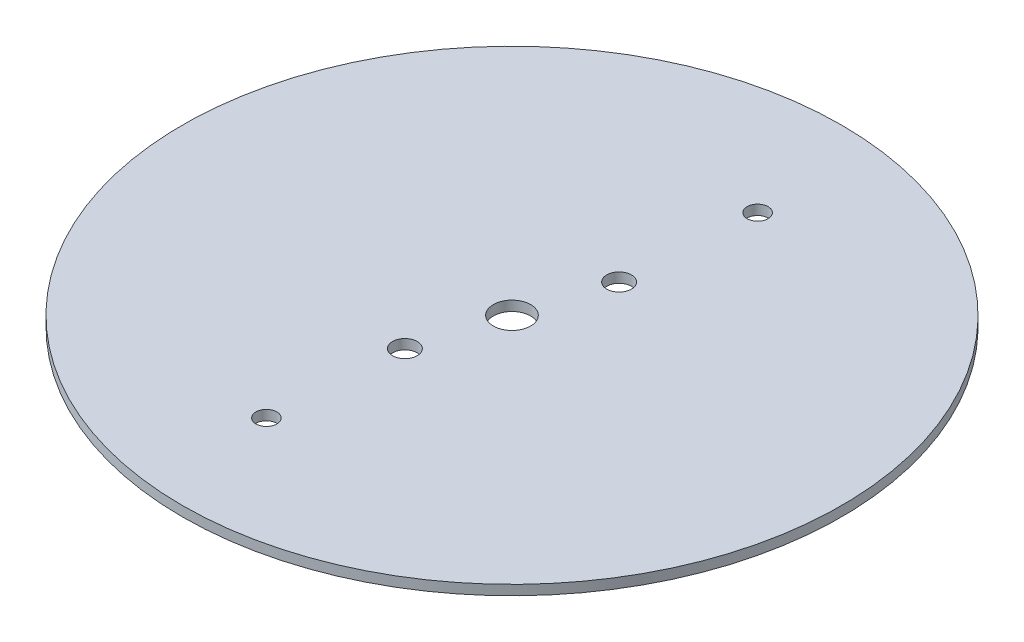
ISO-10303-21;
HEADER;
FILE_DESCRIPTION(('STEP AP214'),'2;1');
FILE_NAME('part.step','',(''),(''),'','','');
FILE_SCHEMA(('AUTOMOTIVE_DESIGN { 1 0 10303 214 1 1 1 1 }'));
ENDSEC;
DATA;
#1=APPLICATION_CONTEXT('core data for automotive mechanical design processes');
#2=APPLICATION_PROTOCOL_DEFINITION('international standard','automotive_design',2000,#1);
#3=PRODUCT_CONTEXT('',#1,'mechanical');
#4=PRODUCT('Part','Part','',(#3));
#5=PRODUCT_RELATED_PRODUCT_CATEGORY('part','',(#4));
#6=PRODUCT_DEFINITION_FORMATION('','',#4);
#7=PRODUCT_DEFINITION_CONTEXT('part definition',#1,'design');
#8=PRODUCT_DEFINITION('design','',#6,#7);
#9=PRODUCT_DEFINITION_SHAPE('','',#8);
#10=(LENGTH_UNIT() NAMED_UNIT(*) SI_UNIT(.MILLI.,.METRE.));
#11=(NAMED_UNIT(*) PLANE_ANGLE_UNIT() SI_UNIT($,.RADIAN.));
#12=(NAMED_UNIT(*) SI_UNIT($,.STERADIAN.) SOLID_ANGLE_UNIT());
#13=UNCERTAINTY_MEASURE_WITH_UNIT(LENGTH_MEASURE(1.E-05),#10,'distance_accuracy_value','');
#14=(GEOMETRIC_REPRESENTATION_CONTEXT(3) GLOBAL_UNCERTAINTY_ASSIGNED_CONTEXT((#13)) GLOBAL_UNIT_ASSIGNED_CONTEXT((#10,
#11,#12)) REPRESENTATION_CONTEXT('',''));
#15=CARTESIAN_POINT('',(0.,0.,0.));
#16=DIRECTION('',(0.,0.,1.));
#17=DIRECTION('',(1.,0.,0.));
#18=AXIS2_PLACEMENT_3D('',#15,#16,#17);
#19=CARTESIAN_POINT('',(0.,0.6,0.));
#20=DIRECTION('',(0.,1.,0.));
#21=DIRECTION('',(0.,0.,1.));
#22=AXIS2_PLACEMENT_3D('',#19,#20,#21);
#23=PLANE('',#22);
#24=CARTESIAN_POINT('',(-2.05801875,0.6,12.846715625));
#25=DIRECTION('',(0.,1.,0.));
#26=DIRECTION('',(0.,0.,1.));
#27=AXIS2_PLACEMENT_3D('',#24,#25,#26);
#28=CIRCLE('',#27,0.635);
#29=CARTESIAN_POINT('',(-2.05801875,0.6,13.481715625));
#30=VERTEX_POINT('',#29);
#31=EDGE_CURVE('E88',#30,#30,#28,.T.);
#32=ORIENTED_EDGE('',*,*,#31,.F.);
#33=EDGE_LOOP('',(#32));
#34=FACE_BOUND('',#33,.T.);
#35=CARTESIAN_POINT('',(0.,0.6,0.));
#36=DIRECTION('',(0.,1.,0.));
#37=DIRECTION('',(0.,0.,1.));
#38=AXIS2_PLACEMENT_3D('',#35,#36,#37);
#39=CIRCLE('',#38,1.1303);
#40=CARTESIAN_POINT('',(0.,0.6,1.1303));
#41=VERTEX_POINT('',#40);
#42=EDGE_CURVE('E76',#41,#41,#39,.T.);
#43=ORIENTED_EDGE('',*,*,#42,.F.);
#44=EDGE_LOOP('',(#43));
#45=FACE_BOUND('',#44,.T.);
#46=CARTESIAN_POINT('',(0.,0.6,0.));
#47=DIRECTION('',(0.,1.,0.));
#48=DIRECTION('',(0.,0.,1.));
#49=AXIS2_PLACEMENT_3D('',#46,#47,#48);
#50=CIRCLE('',#49,20.);
#51=CARTESIAN_POINT('',(0.,0.6,20.));
#52=VERTEX_POINT('',#51);
#53=EDGE_CURVE('E11',#52,#52,#50,.T.);
#54=ORIENTED_EDGE('',*,*,#53,.T.);
#55=EDGE_LOOP('',(#54));
#56=FACE_BOUND('',#55,.T.);
#57=CARTESIAN_POINT('',(-1.5,0.6,5.));
#58=DIRECTION('',(0.,1.,0.));
#59=DIRECTION('',(0.,0.,1.));
#60=AXIS2_PLACEMENT_3D('',#57,#58,#59);
#61=CIRCLE('',#60,0.75);
#62=CARTESIAN_POINT('',(-1.5,0.6,5.75));
#63=VERTEX_POINT('',#62);
#64=EDGE_CURVE('E71',#63,#63,#61,.T.);
#65=ORIENTED_EDGE('',*,*,#64,.F.);
#66=EDGE_LOOP('',(#65));
#67=FACE_BOUND('',#66,.T.);
#68=CARTESIAN_POINT('',(1.5,0.6,-5.));
#69=DIRECTION('',(0.,1.,0.));
#70=DIRECTION('',(0.,0.,1.));
#71=AXIS2_PLACEMENT_3D('',#68,#69,#70);
#72=CIRCLE('',#71,0.75);
#73=CARTESIAN_POINT('',(1.5,0.6,-4.25));
#74=VERTEX_POINT('',#73);
#75=EDGE_CURVE('E82',#74,#74,#72,.T.);
#76=ORIENTED_EDGE('',*,*,#75,.F.);
#77=EDGE_LOOP('',(#76));
#78=FACE_BOUND('',#77,.T.);
#79=CARTESIAN_POINT('',(2.05801875,0.6,-12.846715625));
#80=DIRECTION('',(0.,1.,0.));
#81=DIRECTION('',(0.,0.,1.));
#82=AXIS2_PLACEMENT_3D('',#79,#80,#81);
#83=CIRCLE('',#82,0.635000000000001);
#84=CARTESIAN_POINT('',(2.05801875,0.6,-12.211715625));
#85=VERTEX_POINT('',#84);
#86=EDGE_CURVE('E94',#85,#85,#83,.T.);
#87=ORIENTED_EDGE('',*,*,#86,.F.);
#88=EDGE_LOOP('',(#87));
#89=FACE_BOUND('',#88,.T.);
#90=ADVANCED_FACE('F60',(#34,#45,#56,#67,#78,#89),#23,.T.);
#91=CARTESIAN_POINT('',(0.,0.,0.));
#92=DIRECTION('',(0.,1.,0.));
#93=DIRECTION('',(0.,0.,1.));
#94=AXIS2_PLACEMENT_3D('',#91,#92,#93);
#95=PLANE('',#94);
#96=CARTESIAN_POINT('',(0.,0.,0.));
#97=DIRECTION('',(0.,1.,0.));
#98=DIRECTION('',(0.,0.,1.));
#99=AXIS2_PLACEMENT_3D('',#96,#97,#98);
#100=CIRCLE('',#99,20.);
#101=CARTESIAN_POINT('',(0.,0.,20.));
#102=VERTEX_POINT('',#101);
#103=EDGE_CURVE('E64',#102,#102,#100,.T.);
#104=ORIENTED_EDGE('',*,*,#103,.F.);
#105=EDGE_LOOP('',(#104));
#106=FACE_BOUND('',#105,.T.);
#107=CARTESIAN_POINT('',(-1.5,0.,5.));
#108=DIRECTION('',(0.,1.,0.));
#109=DIRECTION('',(0.,0.,1.));
#110=AXIS2_PLACEMENT_3D('',#107,#108,#109);
#111=CIRCLE('',#110,0.75);
#112=CARTESIAN_POINT('',(-1.5,0.,5.75));
#113=VERTEX_POINT('',#112);
#114=EDGE_CURVE('E73',#113,#113,#111,.T.);
#115=ORIENTED_EDGE('',*,*,#114,.T.);
#116=EDGE_LOOP('',(#115));
#117=FACE_BOUND('',#116,.T.);
#118=CARTESIAN_POINT('',(0.,0.,0.));
#119=DIRECTION('',(0.,1.,0.));
#120=DIRECTION('',(0.,0.,1.));
#121=AXIS2_PLACEMENT_3D('',#118,#119,#120);
#122=CIRCLE('',#121,1.1303);
#123=CARTESIAN_POINT('',(0.,0.,1.1303));
#124=VERTEX_POINT('',#123);
#125=EDGE_CURVE('E79',#124,#124,#122,.T.);
#126=ORIENTED_EDGE('',*,*,#125,.T.);
#127=EDGE_LOOP('',(#126));
#128=FACE_BOUND('',#127,.T.);
#129=CARTESIAN_POINT('',(1.5,0.,-5.));
#130=DIRECTION('',(0.,1.,0.));
#131=DIRECTION('',(0.,0.,1.));
#132=AXIS2_PLACEMENT_3D('',#129,#130,#131);
#133=CIRCLE('',#132,0.75);
#134=CARTESIAN_POINT('',(1.5,0.,-4.25));
#135=VERTEX_POINT('',#134);
#136=EDGE_CURVE('E85',#135,#135,#133,.T.);
#137=ORIENTED_EDGE('',*,*,#136,.T.);
#138=EDGE_LOOP('',(#137));
#139=FACE_BOUND('',#138,.T.);
#140=CARTESIAN_POINT('',(-2.05801875,0.,12.846715625));
#141=DIRECTION('',(0.,1.,0.));
#142=DIRECTION('',(0.,0.,1.));
#143=AXIS2_PLACEMENT_3D('',#140,#141,#142);
#144=CIRCLE('',#143,0.635);
#145=CARTESIAN_POINT('',(-2.05801875,0.,13.481715625));
#146=VERTEX_POINT('',#145);
#147=EDGE_CURVE('E91',#146,#146,#144,.T.);
#148=ORIENTED_EDGE('',*,*,#147,.T.);
#149=EDGE_LOOP('',(#148));
#150=FACE_BOUND('',#149,.T.);
#151=CARTESIAN_POINT('',(2.05801875,0.,-12.846715625));
#152=DIRECTION('',(0.,1.,0.));
#153=DIRECTION('',(0.,0.,1.));
#154=AXIS2_PLACEMENT_3D('',#151,#152,#153);
#155=CIRCLE('',#154,0.635000000000001);
#156=CARTESIAN_POINT('',(2.05801875,0.,-12.211715625));
#157=VERTEX_POINT('',#156);
#158=EDGE_CURVE('E97',#157,#157,#155,.T.);
#159=ORIENTED_EDGE('',*,*,#158,.T.);
#160=EDGE_LOOP('',(#159));
#161=FACE_BOUND('',#160,.T.);
#162=ADVANCED_FACE('F107',(#106,#117,#128,#139,#150,#161),#95,.F.);
#163=CARTESIAN_POINT('',(0.,0.6,0.));
#164=DIRECTION('',(0.,-1.,0.));
#165=DIRECTION('',(0.,0.,-1.));
#166=AXIS2_PLACEMENT_3D('',#163,#164,#165);
#167=CYLINDRICAL_SURFACE('',#166,20.);
#168=ORIENTED_EDGE('',*,*,#53,.F.);
#169=EDGE_LOOP('',(#168));
#170=FACE_BOUND('',#169,.T.);
#171=ORIENTED_EDGE('',*,*,#103,.T.);
#172=EDGE_LOOP('',(#171));
#173=FACE_BOUND('',#172,.T.);
#174=ADVANCED_FACE('F62',(#170,#173),#167,.T.);
#175=CARTESIAN_POINT('',(-1.5,0.6,5.));
#176=DIRECTION('',(0.,-1.,0.));
#177=DIRECTION('',(0.,0.,-1.));
#178=AXIS2_PLACEMENT_3D('',#175,#176,#177);
#179=CYLINDRICAL_SURFACE('',#178,0.75);
#180=ORIENTED_EDGE('',*,*,#64,.T.);
#181=EDGE_LOOP('',(#180));
#182=FACE_BOUND('',#181,.T.);
#183=ORIENTED_EDGE('',*,*,#114,.F.);
#184=EDGE_LOOP('',(#183));
#185=FACE_BOUND('',#184,.T.);
#186=ADVANCED_FACE('F117',(#182,#185),#179,.F.);
#187=CARTESIAN_POINT('',(0.,0.6,0.));
#188=DIRECTION('',(0.,-1.,0.));
#189=DIRECTION('',(0.,0.,-1.));
#190=AXIS2_PLACEMENT_3D('',#187,#188,#189);
#191=CYLINDRICAL_SURFACE('',#190,1.1303);
#192=ORIENTED_EDGE('',*,*,#42,.T.);
#193=EDGE_LOOP('',(#192));
#194=FACE_BOUND('',#193,.T.);
#195=ORIENTED_EDGE('',*,*,#125,.F.);
#196=EDGE_LOOP('',(#195));
#197=FACE_BOUND('',#196,.T.);
#198=ADVANCED_FACE('F120',(#194,#197),#191,.F.);
#199=CARTESIAN_POINT('',(1.5,0.6,-5.));
#200=DIRECTION('',(0.,-1.,0.));
#201=DIRECTION('',(0.,0.,-1.));
#202=AXIS2_PLACEMENT_3D('',#199,#200,#201);
#203=CYLINDRICAL_SURFACE('',#202,0.75);
#204=ORIENTED_EDGE('',*,*,#75,.T.);
#205=EDGE_LOOP('',(#204));
#206=FACE_BOUND('',#205,.T.);
#207=ORIENTED_EDGE('',*,*,#136,.F.);
#208=EDGE_LOOP('',(#207));
#209=FACE_BOUND('',#208,.T.);
#210=ADVANCED_FACE('F124',(#206,#209),#203,.F.);
#211=CARTESIAN_POINT('',(-2.05801875,0.6,12.846715625));
#212=DIRECTION('',(0.,-1.,0.));
#213=DIRECTION('',(0.,0.,-1.));
#214=AXIS2_PLACEMENT_3D('',#211,#212,#213);
#215=CYLINDRICAL_SURFACE('',#214,0.635);
#216=ORIENTED_EDGE('',*,*,#31,.T.);
#217=EDGE_LOOP('',(#216));
#218=FACE_BOUND('',#217,.T.);
#219=ORIENTED_EDGE('',*,*,#147,.F.);
#220=EDGE_LOOP('',(#219));
#221=FACE_BOUND('',#220,.T.);
#222=ADVANCED_FACE('F128',(#218,#221),#215,.F.);
#223=CARTESIAN_POINT('',(2.05801875,0.6,-12.846715625));
#224=DIRECTION('',(0.,-1.,0.));
#225=DIRECTION('',(0.,0.,-1.));
#226=AXIS2_PLACEMENT_3D('',#223,#224,#225);
#227=CYLINDRICAL_SURFACE('',#226,0.635000000000001);
#228=ORIENTED_EDGE('',*,*,#86,.T.);
#229=EDGE_LOOP('',(#228));
#230=FACE_BOUND('',#229,.T.);
#231=ORIENTED_EDGE('',*,*,#158,.F.);
#232=EDGE_LOOP('',(#231));
#233=FACE_BOUND('',#232,.T.);
#234=ADVANCED_FACE('F103',(#230,#233),#227,.F.);
#235=CLOSED_SHELL('',(#90,#162,#174,#186,#198,#210,#222,#234));
#236=MANIFOLD_SOLID_BREP('B2',#235);
#237=ADVANCED_BREP_SHAPE_REPRESENTATION('',(#18,#236),#14);
#238=SHAPE_DEFINITION_REPRESENTATION(#9,#237);
ENDSEC;
END-ISO-10303-21;
